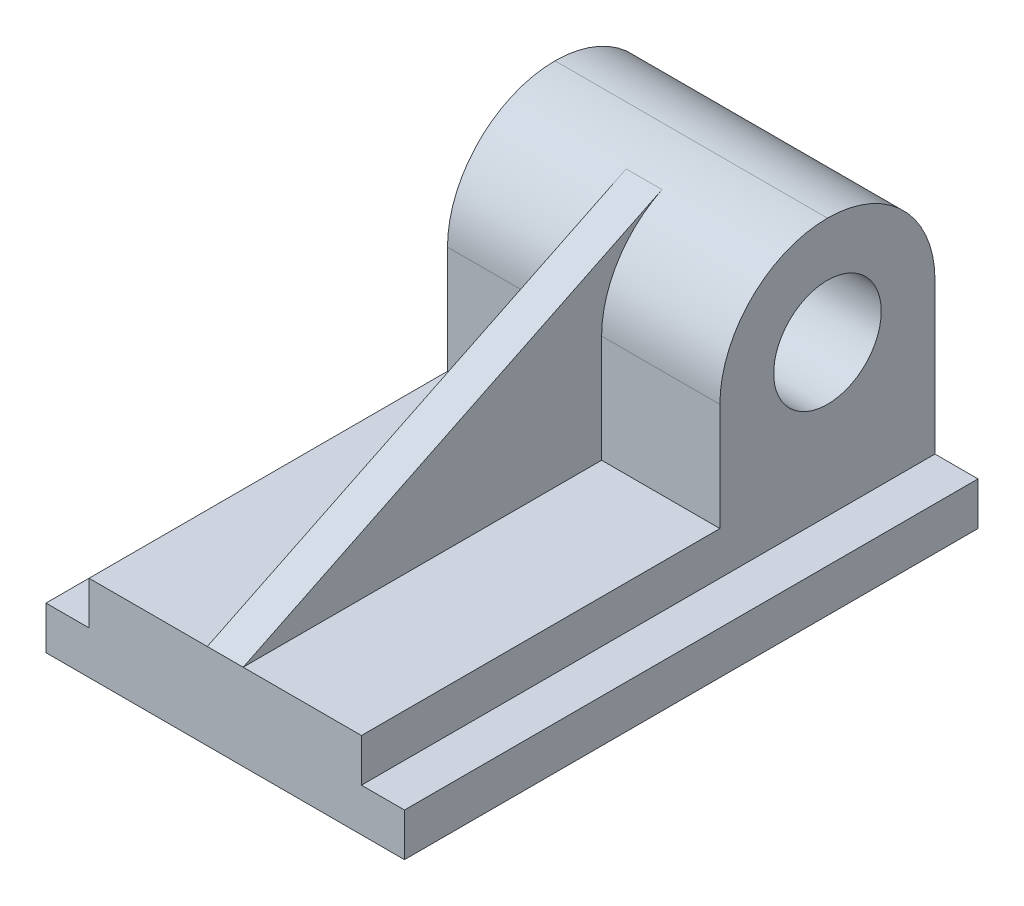
ISO-10303-21;
HEADER;
FILE_DESCRIPTION(('STEP AP214'),'2;1');
FILE_NAME('part.step','',(''),(''),'','','');
FILE_SCHEMA(('AUTOMOTIVE_DESIGN { 1 0 10303 214 1 1 1 1 }'));
ENDSEC;
DATA;
#1=APPLICATION_CONTEXT('core data for automotive mechanical design processes');
#2=APPLICATION_PROTOCOL_DEFINITION('international standard','automotive_design',2000,#1);
#3=PRODUCT_CONTEXT('',#1,'mechanical');
#4=PRODUCT('Part','Part','',(#3));
#5=PRODUCT_RELATED_PRODUCT_CATEGORY('part','',(#4));
#6=PRODUCT_DEFINITION_FORMATION('','',#4);
#7=PRODUCT_DEFINITION_CONTEXT('part definition',#1,'design');
#8=PRODUCT_DEFINITION('design','',#6,#7);
#9=PRODUCT_DEFINITION_SHAPE('','',#8);
#10=(LENGTH_UNIT() NAMED_UNIT(*) SI_UNIT(.MILLI.,.METRE.));
#11=(NAMED_UNIT(*) PLANE_ANGLE_UNIT() SI_UNIT($,.RADIAN.));
#12=(NAMED_UNIT(*) SI_UNIT($,.STERADIAN.) SOLID_ANGLE_UNIT());
#13=UNCERTAINTY_MEASURE_WITH_UNIT(LENGTH_MEASURE(1.E-05),#10,'distance_accuracy_value','');
#14=(GEOMETRIC_REPRESENTATION_CONTEXT(3) GLOBAL_UNCERTAINTY_ASSIGNED_CONTEXT((#13)) GLOBAL_UNIT_ASSIGNED_CONTEXT((#10,
#11,#12)) REPRESENTATION_CONTEXT('',''));
#15=CARTESIAN_POINT('',(0.,0.,0.));
#16=DIRECTION('',(0.,0.,1.));
#17=DIRECTION('',(1.,0.,0.));
#18=AXIS2_PLACEMENT_3D('',#15,#16,#17);
#19=CARTESIAN_POINT('',(-38.,5.99999999999999,80.));
#20=DIRECTION('',(0.,1.,0.));
#21=DIRECTION('',(0.,0.,1.));
#22=AXIS2_PLACEMENT_3D('',#19,#20,#21);
#23=PLANE('',#22);
#24=DIRECTION('',(1.,0.,0.));
#25=VECTOR('',#24,1.);
#26=CARTESIAN_POINT('',(-38.,5.99999999999999,80.));
#27=LINE('',#26,#25);
#28=CARTESIAN_POINT('',(-38.,5.99999999999999,80.));
#29=VERTEX_POINT('',#28);
#30=CARTESIAN_POINT('',(-5.,5.99999999999999,80.));
#31=VERTEX_POINT('',#30);
#32=EDGE_CURVE('E170',#29,#31,#27,.T.);
#33=ORIENTED_EDGE('',*,*,#32,.T.);
#34=DIRECTION('',(0.,0.,-1.));
#35=VECTOR('',#34,1.);
#36=CARTESIAN_POINT('',(-5.,5.99999999999999,80.));
#37=LINE('',#36,#35);
#38=CARTESIAN_POINT('',(-5.,6.,-20.));
#39=VERTEX_POINT('',#38);
#40=EDGE_CURVE('E146',#31,#39,#37,.T.);
#41=ORIENTED_EDGE('',*,*,#40,.T.);
#42=DIRECTION('',(1.,0.,0.));
#43=VECTOR('',#42,1.);
#44=CARTESIAN_POINT('',(-38.,6.,-20.));
#45=LINE('',#44,#43);
#46=CARTESIAN_POINT('',(-38.,6.,-20.));
#47=VERTEX_POINT('',#46);
#48=EDGE_CURVE('E188',#47,#39,#45,.T.);
#49=ORIENTED_EDGE('',*,*,#48,.F.);
#50=DIRECTION('',(0.,0.,1.));
#51=VECTOR('',#50,1.);
#52=CARTESIAN_POINT('',(-38.,5.99999999999999,80.));
#53=LINE('',#52,#51);
#54=EDGE_CURVE('E180',#47,#29,#53,.T.);
#55=ORIENTED_EDGE('',*,*,#54,.T.);
#56=EDGE_LOOP('',(#33,#41,#49,#55));
#57=FACE_BOUND('',#56,.T.);
#58=ADVANCED_FACE('F39',(#57),#23,.T.);
#59=CARTESIAN_POINT('',(-38.,6.,-20.));
#60=DIRECTION('',(0.,0.,1.));
#61=DIRECTION('',(1.,0.,0.));
#62=AXIS2_PLACEMENT_3D('',#59,#60,#61);
#63=PLANE('',#62);
#64=ORIENTED_EDGE('',*,*,#48,.T.);
#65=DIRECTION('',(0.,1.,0.));
#66=VECTOR('',#65,1.);
#67=CARTESIAN_POINT('',(-5.,6.,-20.));
#68=LINE('',#67,#66);
#69=CARTESIAN_POINT('',(-5.,36.,-20.));
#70=VERTEX_POINT('',#69);
#71=EDGE_CURVE('E149',#39,#70,#68,.T.);
#72=ORIENTED_EDGE('',*,*,#71,.T.);
#73=DIRECTION('',(1.,0.,0.));
#74=VECTOR('',#73,1.);
#75=CARTESIAN_POINT('',(-38.,36.,-20.));
#76=LINE('',#75,#74);
#77=CARTESIAN_POINT('',(-38.,36.,-20.));
#78=VERTEX_POINT('',#77);
#79=EDGE_CURVE('E207',#70,#78,#76,.F.);
#80=ORIENTED_EDGE('',*,*,#79,.T.);
#81=DIRECTION('',(0.,-1.,0.));
#82=VECTOR('',#81,1.);
#83=CARTESIAN_POINT('',(-38.,6.,-20.));
#84=LINE('',#83,#82);
#85=EDGE_CURVE('E250',#78,#47,#84,.T.);
#86=ORIENTED_EDGE('',*,*,#85,.T.);
#87=EDGE_LOOP('',(#64,#72,#80,#86));
#88=FACE_BOUND('',#87,.T.);
#89=ADVANCED_FACE('F370',(#88),#63,.T.);
#90=CARTESIAN_POINT('',(-38.,5.99999999999999,80.));
#91=DIRECTION('',(0.,0.,1.));
#92=DIRECTION('',(1.,0.,0.));
#93=AXIS2_PLACEMENT_3D('',#90,#91,#92);
#94=PLANE('',#93);
#95=CARTESIAN_POINT('',(5.,5.99999999999999,80.));
#96=VERTEX_POINT('',#95);
#97=CARTESIAN_POINT('',(38.,5.99999999999999,80.));
#98=VERTEX_POINT('',#97);
#99=EDGE_CURVE('E173',#96,#98,#27,.T.);
#100=ORIENTED_EDGE('',*,*,#99,.F.);
#101=DIRECTION('',(-1.,0.,0.));
#102=VECTOR('',#101,1.);
#103=CARTESIAN_POINT('',(-38.,5.99999999999999,80.));
#104=LINE('',#103,#102);
#105=EDGE_CURVE('E162',#31,#96,#104,.F.);
#106=ORIENTED_EDGE('',*,*,#105,.F.);
#107=ORIENTED_EDGE('',*,*,#32,.F.);
#108=DIRECTION('',(0.,-1.,0.));
#109=VECTOR('',#108,1.);
#110=CARTESIAN_POINT('',(-38.,5.99999999999999,80.));
#111=LINE('',#110,#109);
#112=CARTESIAN_POINT('',(-38.,-5.99999999999999,80.));
#113=VERTEX_POINT('',#112);
#114=EDGE_CURVE('E254',#29,#113,#111,.T.);
#115=ORIENTED_EDGE('',*,*,#114,.T.);
#116=DIRECTION('',(-1.,0.,0.));
#117=VECTOR('',#116,1.);
#118=CARTESIAN_POINT('',(-50.,-6.,80.));
#119=LINE('',#118,#117);
#120=CARTESIAN_POINT('',(-50.,-6.,80.));
#121=VERTEX_POINT('',#120);
#122=EDGE_CURVE('E311',#113,#121,#119,.T.);
#123=ORIENTED_EDGE('',*,*,#122,.T.);
#124=DIRECTION('',(0.,-1.,0.));
#125=VECTOR('',#124,1.);
#126=CARTESIAN_POINT('',(-50.,-6.,80.));
#127=LINE('',#126,#125);
#128=CARTESIAN_POINT('',(-50.,-18.,80.));
#129=VERTEX_POINT('',#128);
#130=EDGE_CURVE('E229',#121,#129,#127,.T.);
#131=ORIENTED_EDGE('',*,*,#130,.T.);
#132=DIRECTION('',(1.,0.,0.));
#133=VECTOR('',#132,1.);
#134=CARTESIAN_POINT('',(-50.,-18.,80.));
#135=LINE('',#134,#133);
#136=CARTESIAN_POINT('',(50.,-18.,80.));
#137=VERTEX_POINT('',#136);
#138=EDGE_CURVE('E316',#129,#137,#135,.T.);
#139=ORIENTED_EDGE('',*,*,#138,.T.);
#140=DIRECTION('',(0.,1.,0.));
#141=VECTOR('',#140,1.);
#142=CARTESIAN_POINT('',(50.,-6.,80.));
#143=LINE('',#142,#141);
#144=CARTESIAN_POINT('',(50.,-6.,80.));
#145=VERTEX_POINT('',#144);
#146=EDGE_CURVE('E312',#137,#145,#143,.T.);
#147=ORIENTED_EDGE('',*,*,#146,.T.);
#148=CARTESIAN_POINT('',(38.,-5.99999999999999,80.));
#149=VERTEX_POINT('',#148);
#150=EDGE_CURVE('E307',#145,#149,#119,.T.);
#151=ORIENTED_EDGE('',*,*,#150,.T.);
#152=DIRECTION('',(0.,-1.,0.));
#153=VECTOR('',#152,1.);
#154=CARTESIAN_POINT('',(38.,5.99999999999999,80.));
#155=LINE('',#154,#153);
#156=EDGE_CURVE('E240',#98,#149,#155,.T.);
#157=ORIENTED_EDGE('',*,*,#156,.F.);
#158=EDGE_LOOP('',(#100,#106,#107,#115,#123,#131,#139,#147,#151,#157));
#159=FACE_BOUND('',#158,.T.);
#160=ADVANCED_FACE('F169',(#159),#94,.T.);
#161=DIRECTION('',(0.,0.,-1.));
#162=VECTOR('',#161,1.);
#163=CARTESIAN_POINT('',(5.,5.99999999999999,80.));
#164=LINE('',#163,#162);
#165=CARTESIAN_POINT('',(5.,6.,-20.));
#166=VERTEX_POINT('',#165);
#167=EDGE_CURVE('E276',#96,#166,#164,.T.);
#168=ORIENTED_EDGE('',*,*,#167,.F.);
#169=ORIENTED_EDGE('',*,*,#99,.T.);
#170=DIRECTION('',(0.,0.,1.));
#171=VECTOR('',#170,1.);
#172=CARTESIAN_POINT('',(38.,5.99999999999999,80.));
#173=LINE('',#172,#171);
#174=CARTESIAN_POINT('',(38.,6.,-20.));
#175=VERTEX_POINT('',#174);
#176=EDGE_CURVE('E236',#175,#98,#173,.T.);
#177=ORIENTED_EDGE('',*,*,#176,.F.);
#178=EDGE_CURVE('E194',#166,#175,#45,.T.);
#179=ORIENTED_EDGE('',*,*,#178,.F.);
#180=EDGE_LOOP('',(#168,#169,#177,#179));
#181=FACE_BOUND('',#180,.T.);
#182=ADVANCED_FACE('F275',(#181),#23,.T.);
#183=DIRECTION('',(0.,1.,0.));
#184=VECTOR('',#183,1.);
#185=CARTESIAN_POINT('',(5.,6.,-20.));
#186=LINE('',#185,#184);
#187=CARTESIAN_POINT('',(5.,36.,-20.));
#188=VERTEX_POINT('',#187);
#189=EDGE_CURVE('E176',#166,#188,#186,.T.);
#190=ORIENTED_EDGE('',*,*,#189,.F.);
#191=ORIENTED_EDGE('',*,*,#178,.T.);
#192=DIRECTION('',(0.,-1.,0.));
#193=VECTOR('',#192,1.);
#194=CARTESIAN_POINT('',(38.,6.,-20.));
#195=LINE('',#194,#193);
#196=CARTESIAN_POINT('',(38.,36.,-20.));
#197=VERTEX_POINT('',#196);
#198=EDGE_CURVE('E220',#197,#175,#195,.T.);
#199=ORIENTED_EDGE('',*,*,#198,.F.);
#200=EDGE_CURVE('E48',#197,#188,#76,.F.);
#201=ORIENTED_EDGE('',*,*,#200,.T.);
#202=EDGE_LOOP('',(#190,#191,#199,#201));
#203=FACE_BOUND('',#202,.T.);
#204=ADVANCED_FACE('F267',(#203),#63,.T.);
#205=CARTESIAN_POINT('',(-38.,6.00000000000001,-80.));
#206=DIRECTION('',(0.,0.,-1.));
#207=DIRECTION('',(-1.,0.,0.));
#208=AXIS2_PLACEMENT_3D('',#205,#206,#207);
#209=PLANE('',#208);
#210=DIRECTION('',(0.,1.,0.));
#211=VECTOR('',#210,1.);
#212=CARTESIAN_POINT('',(50.,-6.,-80.));
#213=LINE('',#212,#211);
#214=CARTESIAN_POINT('',(50.,-18.,-80.));
#215=VERTEX_POINT('',#214);
#216=CARTESIAN_POINT('',(50.,-6.,-80.));
#217=VERTEX_POINT('',#216);
#218=EDGE_CURVE('E293',#215,#217,#213,.T.);
#219=ORIENTED_EDGE('',*,*,#218,.F.);
#220=DIRECTION('',(1.,0.,0.));
#221=VECTOR('',#220,1.);
#222=CARTESIAN_POINT('',(-50.,-18.,-80.));
#223=LINE('',#222,#221);
#224=CARTESIAN_POINT('',(-50.,-18.,-80.));
#225=VERTEX_POINT('',#224);
#226=EDGE_CURVE('E298',#225,#215,#223,.T.);
#227=ORIENTED_EDGE('',*,*,#226,.F.);
#228=DIRECTION('',(0.,-1.,0.));
#229=VECTOR('',#228,1.);
#230=CARTESIAN_POINT('',(-50.,-6.,-80.));
#231=LINE('',#230,#229);
#232=CARTESIAN_POINT('',(-50.,-6.,-80.));
#233=VERTEX_POINT('',#232);
#234=EDGE_CURVE('E292',#233,#225,#231,.T.);
#235=ORIENTED_EDGE('',*,*,#234,.F.);
#236=DIRECTION('',(-1.,0.,0.));
#237=VECTOR('',#236,1.);
#238=CARTESIAN_POINT('',(-50.,-6.,-80.));
#239=LINE('',#238,#237);
#240=CARTESIAN_POINT('',(-38.,-6.,-80.));
#241=VERTEX_POINT('',#240);
#242=EDGE_CURVE('E175',#241,#233,#239,.T.);
#243=ORIENTED_EDGE('',*,*,#242,.F.);
#244=DIRECTION('',(0.,1.,0.));
#245=VECTOR('',#244,1.);
#246=CARTESIAN_POINT('',(-38.,6.00000000000001,-80.));
#247=LINE('',#246,#245);
#248=CARTESIAN_POINT('',(-38.,36.,-80.));
#249=VERTEX_POINT('',#248);
#250=EDGE_CURVE('E246',#241,#249,#247,.T.);
#251=ORIENTED_EDGE('',*,*,#250,.T.);
#252=DIRECTION('',(1.,0.,0.));
#253=VECTOR('',#252,1.);
#254=CARTESIAN_POINT('',(-38.,36.,-80.));
#255=LINE('',#254,#253);
#256=CARTESIAN_POINT('',(38.,36.,-80.));
#257=VERTEX_POINT('',#256);
#258=EDGE_CURVE('E182',#249,#257,#255,.T.);
#259=ORIENTED_EDGE('',*,*,#258,.T.);
#260=DIRECTION('',(0.,1.,0.));
#261=VECTOR('',#260,1.);
#262=CARTESIAN_POINT('',(38.,6.00000000000001,-80.));
#263=LINE('',#262,#261);
#264=CARTESIAN_POINT('',(38.,-5.99999999999999,-80.));
#265=VERTEX_POINT('',#264);
#266=EDGE_CURVE('E212',#265,#257,#263,.T.);
#267=ORIENTED_EDGE('',*,*,#266,.F.);
#268=EDGE_CURVE('E288',#217,#265,#239,.T.);
#269=ORIENTED_EDGE('',*,*,#268,.F.);
#270=EDGE_LOOP('',(#219,#227,#235,#243,#251,#259,#267,#269));
#271=FACE_BOUND('',#270,.T.);
#272=ADVANCED_FACE('F341',(#271),#209,.T.);
#273=CARTESIAN_POINT('',(-38.,0.,0.));
#274=DIRECTION('',(1.,0.,0.));
#275=DIRECTION('',(0.,0.,-1.));
#276=AXIS2_PLACEMENT_3D('',#273,#274,#275);
#277=PLANE('',#276);
#278=CARTESIAN_POINT('',(-38.,36.,-50.));
#279=DIRECTION('',(1.,0.,0.));
#280=DIRECTION('',(0.,0.,-1.));
#281=AXIS2_PLACEMENT_3D('',#278,#279,#280);
#282=CIRCLE('',#281,15.);
#283=CARTESIAN_POINT('',(-38.,36.,-65.));
#284=VERTEX_POINT('',#283);
#285=EDGE_CURVE('E213',#284,#284,#282,.T.);
#286=ORIENTED_EDGE('',*,*,#285,.T.);
#287=EDGE_LOOP('',(#286));
#288=FACE_BOUND('',#287,.T.);
#289=CARTESIAN_POINT('',(-38.,36.,-50.));
#290=DIRECTION('',(1.,0.,0.));
#291=DIRECTION('',(0.,0.,-1.));
#292=AXIS2_PLACEMENT_3D('',#289,#290,#291);
#293=CIRCLE('',#292,30.);
#294=CARTESIAN_POINT('',(-38.,66.,-50.));
#295=VERTEX_POINT('',#294);
#296=EDGE_CURVE('E63',#78,#295,#293,.F.);
#297=ORIENTED_EDGE('',*,*,#296,.T.);
#298=CARTESIAN_POINT('',(-38.,36.,-50.));
#299=DIRECTION('',(1.,0.,0.));
#300=DIRECTION('',(0.,0.,-1.));
#301=AXIS2_PLACEMENT_3D('',#298,#299,#300);
#302=CIRCLE('',#301,30.);
#303=EDGE_CURVE('E204',#295,#249,#302,.F.);
#304=ORIENTED_EDGE('',*,*,#303,.T.);
#305=ORIENTED_EDGE('',*,*,#250,.F.);
#306=DIRECTION('',(0.,0.,-1.));
#307=VECTOR('',#306,1.);
#308=CARTESIAN_POINT('',(-38.,-5.99999999999999,80.));
#309=LINE('',#308,#307);
#310=EDGE_CURVE('E191',#113,#241,#309,.T.);
#311=ORIENTED_EDGE('',*,*,#310,.F.);
#312=ORIENTED_EDGE('',*,*,#114,.F.);
#313=ORIENTED_EDGE('',*,*,#54,.F.);
#314=ORIENTED_EDGE('',*,*,#85,.F.);
#315=EDGE_LOOP('',(#297,#304,#305,#311,#312,#313,#314));
#316=FACE_BOUND('',#315,.T.);
#317=ADVANCED_FACE('F386',(#288,#316),#277,.F.);
#318=CARTESIAN_POINT('',(38.,0.,0.));
#319=DIRECTION('',(1.,0.,0.));
#320=DIRECTION('',(0.,0.,-1.));
#321=AXIS2_PLACEMENT_3D('',#318,#319,#320);
#322=PLANE('',#321);
#323=CARTESIAN_POINT('',(38.,36.,-50.));
#324=DIRECTION('',(1.,0.,0.));
#325=DIRECTION('',(0.,0.,-1.));
#326=AXIS2_PLACEMENT_3D('',#323,#324,#325);
#327=CIRCLE('',#326,15.);
#328=CARTESIAN_POINT('',(38.,36.,-65.));
#329=VERTEX_POINT('',#328);
#330=EDGE_CURVE('E223',#329,#329,#327,.T.);
#331=ORIENTED_EDGE('',*,*,#330,.F.);
#332=EDGE_LOOP('',(#331));
#333=FACE_BOUND('',#332,.T.);
#334=ORIENTED_EDGE('',*,*,#266,.T.);
#335=CARTESIAN_POINT('',(38.,36.,-50.));
#336=DIRECTION('',(1.,0.,0.));
#337=DIRECTION('',(0.,0.,-1.));
#338=AXIS2_PLACEMENT_3D('',#335,#336,#337);
#339=CIRCLE('',#338,30.);
#340=CARTESIAN_POINT('',(38.,66.,-50.));
#341=VERTEX_POINT('',#340);
#342=EDGE_CURVE('E198',#257,#341,#339,.T.);
#343=ORIENTED_EDGE('',*,*,#342,.T.);
#344=CARTESIAN_POINT('',(38.,36.,-50.));
#345=DIRECTION('',(1.,0.,0.));
#346=DIRECTION('',(0.,0.,-1.));
#347=AXIS2_PLACEMENT_3D('',#344,#345,#346);
#348=CIRCLE('',#347,30.);
#349=EDGE_CURVE('E186',#341,#197,#348,.T.);
#350=ORIENTED_EDGE('',*,*,#349,.T.);
#351=ORIENTED_EDGE('',*,*,#198,.T.);
#352=ORIENTED_EDGE('',*,*,#176,.T.);
#353=ORIENTED_EDGE('',*,*,#156,.T.);
#354=DIRECTION('',(0.,0.,-1.));
#355=VECTOR('',#354,1.);
#356=CARTESIAN_POINT('',(38.,-5.99999999999999,80.));
#357=LINE('',#356,#355);
#358=EDGE_CURVE('E243',#149,#265,#357,.T.);
#359=ORIENTED_EDGE('',*,*,#358,.T.);
#360=EDGE_LOOP('',(#334,#343,#350,#351,#352,#353,#359));
#361=FACE_BOUND('',#360,.T.);
#362=ADVANCED_FACE('F273',(#333,#361),#322,.T.);
#363=CARTESIAN_POINT('',(-38.,36.,-50.));
#364=DIRECTION('',(1.,0.,0.));
#365=DIRECTION('',(0.,0.,-1.));
#366=AXIS2_PLACEMENT_3D('',#363,#364,#365);
#367=CYLINDRICAL_SURFACE('',#366,30.);
#368=ORIENTED_EDGE('',*,*,#349,.F.);
#369=DIRECTION('',(1.,0.,0.));
#370=VECTOR('',#369,1.);
#371=CARTESIAN_POINT('',(-38.,66.,-50.));
#372=LINE('',#371,#370);
#373=EDGE_CURVE('E210',#295,#341,#372,.T.);
#374=ORIENTED_EDGE('',*,*,#373,.F.);
#375=ORIENTED_EDGE('',*,*,#296,.F.);
#376=ORIENTED_EDGE('',*,*,#79,.F.);
#377=CARTESIAN_POINT('',(-5.,36.,-50.));
#378=DIRECTION('',(1.,0.,0.));
#379=DIRECTION('',(0.,0.,-1.));
#380=AXIS2_PLACEMENT_3D('',#377,#378,#379);
#381=CIRCLE('',#380,30.);
#382=CARTESIAN_POINT('',(-5.,62.9662921348314,-36.8539325842697));
#383=VERTEX_POINT('',#382);
#384=EDGE_CURVE('E155',#70,#383,#381,.F.);
#385=ORIENTED_EDGE('',*,*,#384,.T.);
#386=DIRECTION('',(1.,0.,0.));
#387=VECTOR('',#386,1.);
#388=CARTESIAN_POINT('',(-38.,62.9662921348314,-36.8539325842697));
#389=LINE('',#388,#387);
#390=CARTESIAN_POINT('',(5.,62.9662921348314,-36.8539325842697));
#391=VERTEX_POINT('',#390);
#392=EDGE_CURVE('E11',#383,#391,#389,.T.);
#393=ORIENTED_EDGE('',*,*,#392,.T.);
#394=CARTESIAN_POINT('',(5.,36.,-50.));
#395=DIRECTION('',(1.,0.,0.));
#396=DIRECTION('',(0.,0.,-1.));
#397=AXIS2_PLACEMENT_3D('',#394,#395,#396);
#398=CIRCLE('',#397,30.);
#399=EDGE_CURVE('E279',#188,#391,#398,.F.);
#400=ORIENTED_EDGE('',*,*,#399,.F.);
#401=ORIENTED_EDGE('',*,*,#200,.F.);
#402=EDGE_LOOP('',(#368,#374,#375,#376,#385,#393,#400,#401));
#403=FACE_BOUND('',#402,.T.);
#404=ADVANCED_FACE('F41',(#403),#367,.T.);
#405=CARTESIAN_POINT('',(-38.,36.,-50.));
#406=DIRECTION('',(1.,0.,0.));
#407=DIRECTION('',(0.,0.,-1.));
#408=AXIS2_PLACEMENT_3D('',#405,#406,#407);
#409=CYLINDRICAL_SURFACE('',#408,30.);
#410=ORIENTED_EDGE('',*,*,#342,.F.);
#411=ORIENTED_EDGE('',*,*,#258,.F.);
#412=ORIENTED_EDGE('',*,*,#303,.F.);
#413=ORIENTED_EDGE('',*,*,#373,.T.);
#414=EDGE_LOOP('',(#410,#411,#412,#413));
#415=FACE_BOUND('',#414,.T.);
#416=ADVANCED_FACE('F364',(#415),#409,.T.);
#417=CARTESIAN_POINT('',(-38.,36.,-50.));
#418=DIRECTION('',(1.,0.,0.));
#419=DIRECTION('',(0.,0.,-1.));
#420=AXIS2_PLACEMENT_3D('',#417,#418,#419);
#421=CYLINDRICAL_SURFACE('',#420,15.);
#422=ORIENTED_EDGE('',*,*,#330,.T.);
#423=EDGE_LOOP('',(#422));
#424=FACE_BOUND('',#423,.T.);
#425=ORIENTED_EDGE('',*,*,#285,.F.);
#426=EDGE_LOOP('',(#425));
#427=FACE_BOUND('',#426,.T.);
#428=ADVANCED_FACE('F357',(#424,#427),#421,.F.);
#429=CARTESIAN_POINT('',(-50.,-6.,180.717426496113));
#430=DIRECTION('',(0.,-1.,0.));
#431=DIRECTION('',(0.,0.,-1.));
#432=AXIS2_PLACEMENT_3D('',#429,#430,#431);
#433=PLANE('',#432);
#434=ORIENTED_EDGE('',*,*,#122,.F.);
#435=ORIENTED_EDGE('',*,*,#310,.T.);
#436=ORIENTED_EDGE('',*,*,#242,.T.);
#437=DIRECTION('',(0.,0.,-1.));
#438=VECTOR('',#437,1.);
#439=CARTESIAN_POINT('',(-50.,-6.,180.717426496113));
#440=LINE('',#439,#438);
#441=EDGE_CURVE('E323',#121,#233,#440,.T.);
#442=ORIENTED_EDGE('',*,*,#441,.F.);
#443=EDGE_LOOP('',(#434,#435,#436,#442));
#444=FACE_BOUND('',#443,.T.);
#445=ADVANCED_FACE('F354',(#444),#433,.F.);
#446=CARTESIAN_POINT('',(50.,-6.,180.717426496113));
#447=DIRECTION('',(-1.,0.,0.));
#448=DIRECTION('',(0.,0.,1.));
#449=AXIS2_PLACEMENT_3D('',#446,#447,#448);
#450=PLANE('',#449);
#451=ORIENTED_EDGE('',*,*,#146,.F.);
#452=DIRECTION('',(0.,0.,-1.));
#453=VECTOR('',#452,1.);
#454=CARTESIAN_POINT('',(50.,-18.,180.717426496113));
#455=LINE('',#454,#453);
#456=EDGE_CURVE('E297',#137,#215,#455,.T.);
#457=ORIENTED_EDGE('',*,*,#456,.T.);
#458=ORIENTED_EDGE('',*,*,#218,.T.);
#459=DIRECTION('',(0.,0.,-1.));
#460=VECTOR('',#459,1.);
#461=CARTESIAN_POINT('',(50.,-6.,180.717426496113));
#462=LINE('',#461,#460);
#463=EDGE_CURVE('E320',#145,#217,#462,.T.);
#464=ORIENTED_EDGE('',*,*,#463,.F.);
#465=EDGE_LOOP('',(#451,#457,#458,#464));
#466=FACE_BOUND('',#465,.T.);
#467=ADVANCED_FACE('F334',(#466),#450,.F.);
#468=ORIENTED_EDGE('',*,*,#358,.F.);
#469=ORIENTED_EDGE('',*,*,#150,.F.);
#470=ORIENTED_EDGE('',*,*,#463,.T.);
#471=ORIENTED_EDGE('',*,*,#268,.T.);
#472=EDGE_LOOP('',(#468,#469,#470,#471));
#473=FACE_BOUND('',#472,.T.);
#474=ADVANCED_FACE('F346',(#473),#433,.F.);
#475=CARTESIAN_POINT('',(-50.,-6.,180.717426496113));
#476=DIRECTION('',(1.,0.,0.));
#477=DIRECTION('',(0.,0.,-1.));
#478=AXIS2_PLACEMENT_3D('',#475,#476,#477);
#479=PLANE('',#478);
#480=ORIENTED_EDGE('',*,*,#130,.F.);
#481=ORIENTED_EDGE('',*,*,#441,.T.);
#482=ORIENTED_EDGE('',*,*,#234,.T.);
#483=DIRECTION('',(0.,0.,-1.));
#484=VECTOR('',#483,1.);
#485=CARTESIAN_POINT('',(-50.,-18.,180.717426496113));
#486=LINE('',#485,#484);
#487=EDGE_CURVE('E319',#129,#225,#486,.T.);
#488=ORIENTED_EDGE('',*,*,#487,.F.);
#489=EDGE_LOOP('',(#480,#481,#482,#488));
#490=FACE_BOUND('',#489,.T.);
#491=ADVANCED_FACE('F350',(#490),#479,.F.);
#492=CARTESIAN_POINT('',(-50.,-18.,180.717426496113));
#493=DIRECTION('',(0.,1.,0.));
#494=DIRECTION('',(0.,0.,1.));
#495=AXIS2_PLACEMENT_3D('',#492,#493,#494);
#496=PLANE('',#495);
#497=ORIENTED_EDGE('',*,*,#456,.F.);
#498=ORIENTED_EDGE('',*,*,#138,.F.);
#499=ORIENTED_EDGE('',*,*,#487,.T.);
#500=ORIENTED_EDGE('',*,*,#226,.T.);
#501=EDGE_LOOP('',(#497,#498,#499,#500));
#502=FACE_BOUND('',#501,.T.);
#503=ADVANCED_FACE('F348',(#502),#496,.F.);
#504=CARTESIAN_POINT('',(0.,5.99999999999999,80.));
#505=DIRECTION('',(0.,-0.898876404494382,-0.438202247191011));
#506=DIRECTION('',(0.,0.438202247191011,-0.898876404494382));
#507=AXIS2_PLACEMENT_3D('',#504,#505,#506);
#508=PLANE('',#507);
#509=DIRECTION('',(0.,0.438202247191011,-0.898876404494382));
#510=VECTOR('',#509,1.);
#511=CARTESIAN_POINT('',(-5.,5.99999999999999,80.));
#512=LINE('',#511,#510);
#513=EDGE_CURVE('E55',#31,#383,#512,.T.);
#514=ORIENTED_EDGE('',*,*,#513,.F.);
#515=ORIENTED_EDGE('',*,*,#105,.T.);
#516=DIRECTION('',(0.,0.438202247191011,-0.898876404494382));
#517=VECTOR('',#516,1.);
#518=CARTESIAN_POINT('',(5.,5.99999999999999,80.));
#519=LINE('',#518,#517);
#520=EDGE_CURVE('E156',#96,#391,#519,.T.);
#521=ORIENTED_EDGE('',*,*,#520,.T.);
#522=ORIENTED_EDGE('',*,*,#392,.F.);
#523=EDGE_LOOP('',(#514,#515,#521,#522));
#524=FACE_BOUND('',#523,.T.);
#525=ADVANCED_FACE('F160',(#524),#508,.F.);
#526=CARTESIAN_POINT('',(5.,24.,0.));
#527=DIRECTION('',(1.,0.,0.));
#528=DIRECTION('',(0.,0.,-1.));
#529=AXIS2_PLACEMENT_3D('',#526,#527,#528);
#530=PLANE('',#529);
#531=ORIENTED_EDGE('',*,*,#167,.T.);
#532=ORIENTED_EDGE('',*,*,#189,.T.);
#533=ORIENTED_EDGE('',*,*,#399,.T.);
#534=ORIENTED_EDGE('',*,*,#520,.F.);
#535=EDGE_LOOP('',(#531,#532,#533,#534));
#536=FACE_BOUND('',#535,.T.);
#537=ADVANCED_FACE('F401',(#536),#530,.T.);
#538=CARTESIAN_POINT('',(-5.,24.,0.));
#539=DIRECTION('',(1.,0.,0.));
#540=DIRECTION('',(0.,0.,-1.));
#541=AXIS2_PLACEMENT_3D('',#538,#539,#540);
#542=PLANE('',#541);
#543=ORIENTED_EDGE('',*,*,#71,.F.);
#544=ORIENTED_EDGE('',*,*,#40,.F.);
#545=ORIENTED_EDGE('',*,*,#513,.T.);
#546=ORIENTED_EDGE('',*,*,#384,.F.);
#547=EDGE_LOOP('',(#543,#544,#545,#546));
#548=FACE_BOUND('',#547,.T.);
#549=ADVANCED_FACE('F147',(#548),#542,.F.);
#550=CLOSED_SHELL('',(#58,#89,#160,#182,#204,#272,#317,#362,#404,#416,#428,#445,#467,#474,#491,
#503,#525,#537,#549));
#551=MANIFOLD_SOLID_BREP('B2',#550);
#552=ADVANCED_BREP_SHAPE_REPRESENTATION('',(#18,#551),#14);
#553=SHAPE_DEFINITION_REPRESENTATION(#9,#552);
ENDSEC;
END-ISO-10303-21;
